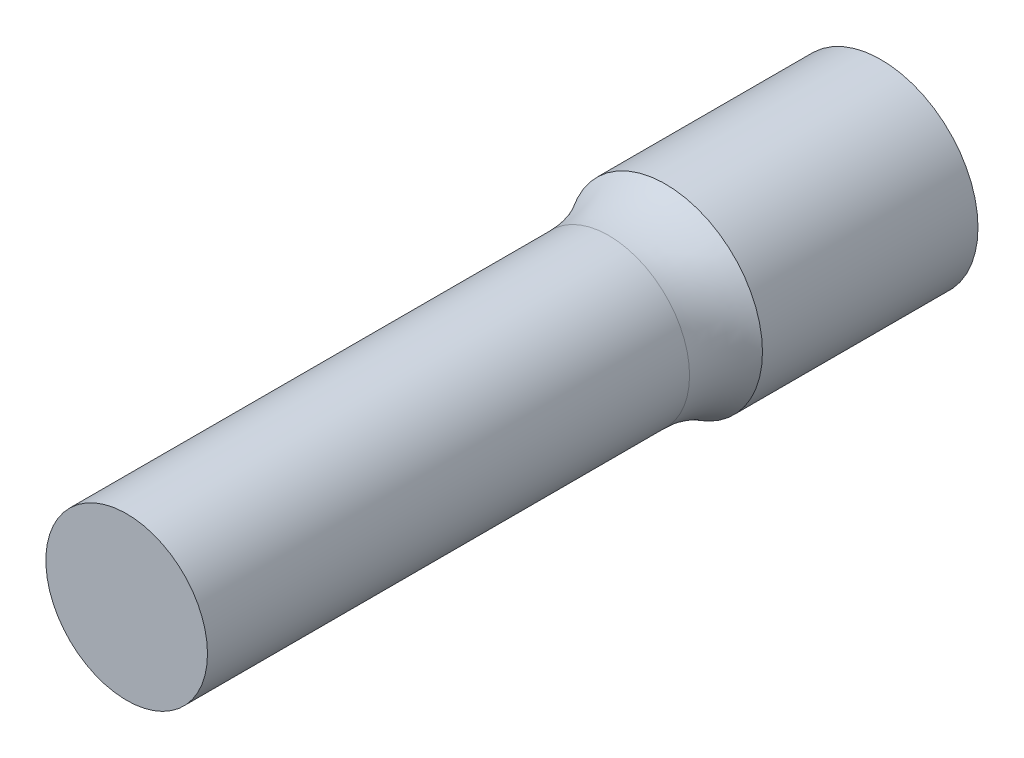
ISO-10303-21;
HEADER;
FILE_DESCRIPTION(('STEP AP214'),'2;1');
FILE_NAME('part.step','',(''),(''),'','','');
FILE_SCHEMA(('AUTOMOTIVE_DESIGN { 1 0 10303 214 1 1 1 1 }'));
ENDSEC;
DATA;
#1=APPLICATION_CONTEXT('core data for automotive mechanical design processes');
#2=APPLICATION_PROTOCOL_DEFINITION('international standard','automotive_design',2000,#1);
#3=PRODUCT_CONTEXT('',#1,'mechanical');
#4=PRODUCT('Part','Part','',(#3));
#5=PRODUCT_RELATED_PRODUCT_CATEGORY('part','',(#4));
#6=PRODUCT_DEFINITION_FORMATION('','',#4);
#7=PRODUCT_DEFINITION_CONTEXT('part definition',#1,'design');
#8=PRODUCT_DEFINITION('design','',#6,#7);
#9=PRODUCT_DEFINITION_SHAPE('','',#8);
#10=(LENGTH_UNIT() NAMED_UNIT(*) SI_UNIT(.MILLI.,.METRE.));
#11=(NAMED_UNIT(*) PLANE_ANGLE_UNIT() SI_UNIT($,.RADIAN.));
#12=(NAMED_UNIT(*) SI_UNIT($,.STERADIAN.) SOLID_ANGLE_UNIT());
#13=UNCERTAINTY_MEASURE_WITH_UNIT(LENGTH_MEASURE(1.E-05),#10,'distance_accuracy_value','');
#14=(GEOMETRIC_REPRESENTATION_CONTEXT(3) GLOBAL_UNCERTAINTY_ASSIGNED_CONTEXT((#13)) GLOBAL_UNIT_ASSIGNED_CONTEXT((#10,
#11,#12)) REPRESENTATION_CONTEXT('',''));
#15=CARTESIAN_POINT('',(0.,0.,0.));
#16=DIRECTION('',(0.,0.,1.));
#17=DIRECTION('',(1.,0.,0.));
#18=AXIS2_PLACEMENT_3D('',#15,#16,#17);
#19=CARTESIAN_POINT('',(0.,0.,70.));
#20=DIRECTION('',(0.,0.,-1.));
#21=DIRECTION('',(-1.,0.,0.));
#22=AXIS2_PLACEMENT_3D('',#19,#20,#21);
#23=CYLINDRICAL_SURFACE('',#22,9.);
#24=CARTESIAN_POINT('',(0.,0.,0.));
#25=DIRECTION('',(0.,0.,1.));
#26=DIRECTION('',(1.,0.,0.));
#27=AXIS2_PLACEMENT_3D('',#24,#25,#26);
#28=CIRCLE('',#27,9.);
#29=CARTESIAN_POINT('',(9.,0.,0.));
#30=VERTEX_POINT('',#29);
#31=EDGE_CURVE('E51',#30,#30,#28,.T.);
#32=ORIENTED_EDGE('',*,*,#31,.T.);
#33=EDGE_LOOP('',(#32));
#34=FACE_BOUND('',#33,.T.);
#35=CARTESIAN_POINT('',(0.,0.,20.));
#36=DIRECTION('',(0.,0.,1.));
#37=DIRECTION('',(1.,0.,0.));
#38=AXIS2_PLACEMENT_3D('',#35,#36,#37);
#39=CIRCLE('',#38,9.);
#40=CARTESIAN_POINT('',(9.,0.,20.));
#41=VERTEX_POINT('',#40);
#42=EDGE_CURVE('E66',#41,#41,#39,.T.);
#43=ORIENTED_EDGE('',*,*,#42,.F.);
#44=EDGE_LOOP('',(#43));
#45=FACE_BOUND('',#44,.T.);
#46=ADVANCED_FACE('F43',(#34,#45),#23,.T.);
#47=CARTESIAN_POINT('',(0.,0.,0.));
#48=DIRECTION('',(0.,0.,1.));
#49=DIRECTION('',(1.,0.,0.));
#50=AXIS2_PLACEMENT_3D('',#47,#48,#49);
#51=PLANE('',#50);
#52=CARTESIAN_POINT('',(0.,0.,0.));
#53=DIRECTION('',(0.,0.,-1.));
#54=DIRECTION('',(-1.,0.,0.));
#55=AXIS2_PLACEMENT_3D('',#52,#53,#54);
#56=CIRCLE('',#55,2.5);
#57=CARTESIAN_POINT('',(-2.5,0.,0.));
#58=VERTEX_POINT('',#57);
#59=EDGE_CURVE('E61',#58,#58,#56,.T.);
#60=ORIENTED_EDGE('',*,*,#59,.F.);
#61=EDGE_LOOP('',(#60));
#62=FACE_BOUND('',#61,.T.);
#63=ORIENTED_EDGE('',*,*,#31,.F.);
#64=EDGE_LOOP('',(#63));
#65=FACE_BOUND('',#64,.T.);
#66=ADVANCED_FACE('F79',(#62,#65),#51,.F.);
#67=CARTESIAN_POINT('',(0.,0.,15.));
#68=DIRECTION('',(0.,0.,-1.));
#69=DIRECTION('',(-1.,0.,0.));
#70=AXIS2_PLACEMENT_3D('',#67,#68,#69);
#71=CYLINDRICAL_SURFACE('',#70,2.5);
#72=CARTESIAN_POINT('',(0.,0.,15.));
#73=DIRECTION('',(0.,0.,-1.));
#74=DIRECTION('',(-1.,0.,0.));
#75=AXIS2_PLACEMENT_3D('',#72,#73,#74);
#76=CIRCLE('',#75,2.5);
#77=CARTESIAN_POINT('',(-2.5,0.,15.));
#78=VERTEX_POINT('',#77);
#79=EDGE_CURVE('E56',#78,#78,#76,.T.);
#80=ORIENTED_EDGE('',*,*,#79,.F.);
#81=EDGE_LOOP('',(#80));
#82=FACE_BOUND('',#81,.T.);
#83=ORIENTED_EDGE('',*,*,#59,.T.);
#84=EDGE_LOOP('',(#83));
#85=FACE_BOUND('',#84,.T.);
#86=ADVANCED_FACE('F85',(#82,#85),#71,.F.);
#87=CARTESIAN_POINT('',(0.,0.,15.));
#88=DIRECTION('',(0.,0.,-1.));
#89=DIRECTION('',(-1.,0.,0.));
#90=AXIS2_PLACEMENT_3D('',#87,#88,#89);
#91=PLANE('',#90);
#92=ORIENTED_EDGE('',*,*,#79,.T.);
#93=EDGE_LOOP('',(#92));
#94=FACE_BOUND('',#93,.T.);
#95=ADVANCED_FACE('F95',(#94),#91,.T.);
#96=CARTESIAN_POINT('',(0.,0.,20.));
#97=DIRECTION('',(0.,0.,1.));
#98=DIRECTION('',(1.,0.,0.));
#99=AXIS2_PLACEMENT_3D('',#96,#97,#98);
#100=CYLINDRICAL_SURFACE('',#99,7.5);
#101=CARTESIAN_POINT('',(0.,0.,25.2678268764264));
#102=DIRECTION('',(0.,0.,-1.));
#103=DIRECTION('',(-1.,0.,0.));
#104=AXIS2_PLACEMENT_3D('',#101,#102,#103);
#105=CIRCLE('',#104,7.5);
#106=CARTESIAN_POINT('',(-7.5,0.,25.2678268764264));
#107=VERTEX_POINT('',#106);
#108=EDGE_CURVE('E10',#107,#107,#105,.F.);
#109=ORIENTED_EDGE('',*,*,#108,.T.);
#110=EDGE_LOOP('',(#109));
#111=FACE_BOUND('',#110,.T.);
#112=CARTESIAN_POINT('',(0.,0.,70.));
#113=DIRECTION('',(0.,0.,1.));
#114=DIRECTION('',(1.,0.,0.));
#115=AXIS2_PLACEMENT_3D('',#112,#113,#114);
#116=CIRCLE('',#115,7.5);
#117=CARTESIAN_POINT('',(7.5,0.,70.));
#118=VERTEX_POINT('',#117);
#119=EDGE_CURVE('E68',#118,#118,#116,.T.);
#120=ORIENTED_EDGE('',*,*,#119,.F.);
#121=EDGE_LOOP('',(#120));
#122=FACE_BOUND('',#121,.T.);
#123=ADVANCED_FACE('F91',(#111,#122),#100,.T.);
#124=CARTESIAN_POINT('',(0.,0.,70.));
#125=DIRECTION('',(0.,0.,1.));
#126=DIRECTION('',(1.,0.,0.));
#127=AXIS2_PLACEMENT_3D('',#124,#125,#126);
#128=PLANE('',#127);
#129=ORIENTED_EDGE('',*,*,#119,.T.);
#130=EDGE_LOOP('',(#129));
#131=FACE_BOUND('',#130,.T.);
#132=ADVANCED_FACE('F89',(#131),#128,.T.);
#133=CARTESIAN_POINT('',(0.,0.,25.2678268764264));
#134=DIRECTION('',(0.,0.,-1.));
#135=DIRECTION('',(-1.,0.,0.));
#136=AXIS2_PLACEMENT_3D('',#133,#134,#135);
#137=TOROIDAL_SURFACE('',#136,17.5,10.);
#138=ORIENTED_EDGE('',*,*,#42,.T.);
#139=EDGE_LOOP('',(#138));
#140=FACE_BOUND('',#139,.T.);
#141=ORIENTED_EDGE('',*,*,#108,.F.);
#142=EDGE_LOOP('',(#141));
#143=FACE_BOUND('',#142,.T.);
#144=ADVANCED_FACE('F45',(#140,#143),#137,.F.);
#145=CLOSED_SHELL('',(#46,#66,#86,#95,#123,#132,#144));
#146=MANIFOLD_SOLID_BREP('B2',#145);
#147=ADVANCED_BREP_SHAPE_REPRESENTATION('',(#18,#146),#14);
#148=SHAPE_DEFINITION_REPRESENTATION(#9,#147);
ENDSEC;
END-ISO-10303-21;
